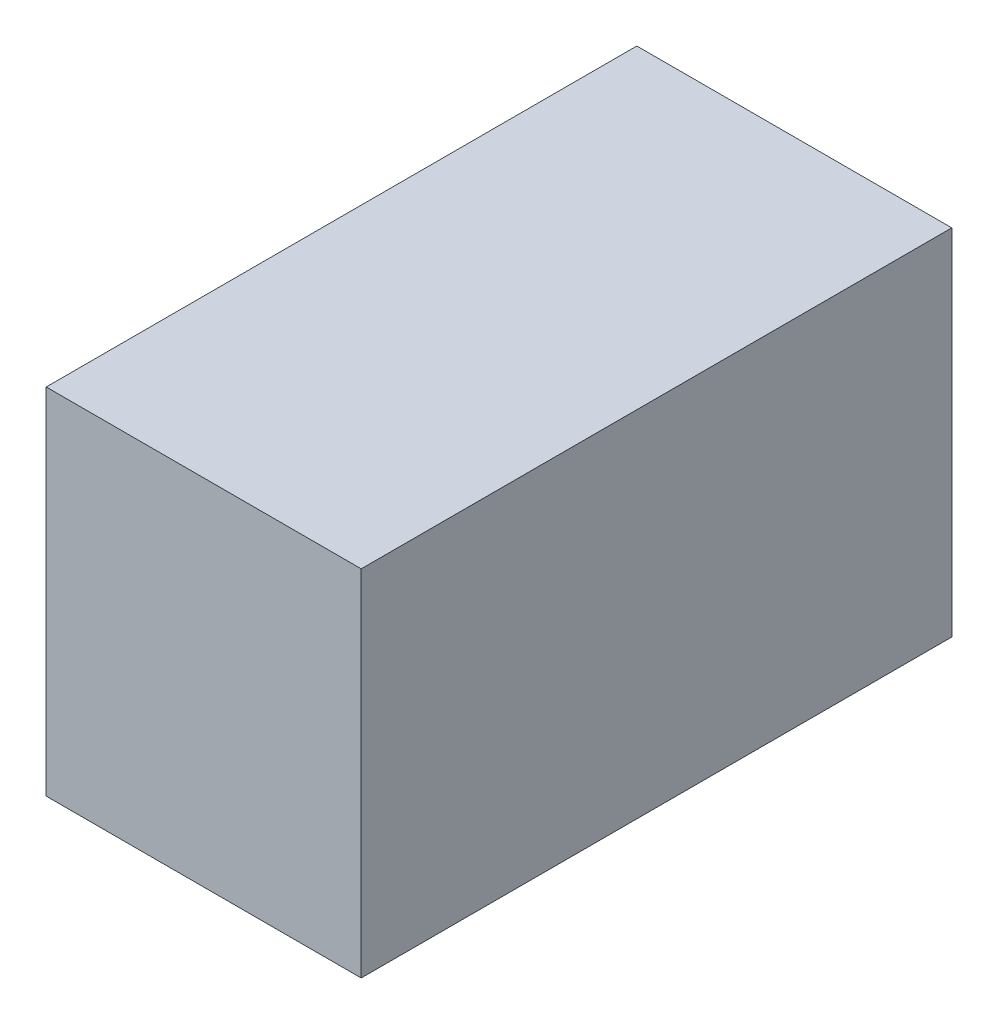
ISO-10303-21;
HEADER;
FILE_DESCRIPTION(('STEP AP214'),'2;1');
FILE_NAME('part.step','',(''),(''),'','','');
FILE_SCHEMA(('AUTOMOTIVE_DESIGN { 1 0 10303 214 1 1 1 1 }'));
ENDSEC;
DATA;
#1=APPLICATION_CONTEXT('core data for automotive mechanical design processes');
#2=APPLICATION_PROTOCOL_DEFINITION('international standard','automotive_design',2000,#1);
#3=PRODUCT_CONTEXT('',#1,'mechanical');
#4=PRODUCT('Part','Part','',(#3));
#5=PRODUCT_RELATED_PRODUCT_CATEGORY('part','',(#4));
#6=PRODUCT_DEFINITION_FORMATION('','',#4);
#7=PRODUCT_DEFINITION_CONTEXT('part definition',#1,'design');
#8=PRODUCT_DEFINITION('design','',#6,#7);
#9=PRODUCT_DEFINITION_SHAPE('','',#8);
#10=(LENGTH_UNIT() NAMED_UNIT(*) SI_UNIT(.MILLI.,.METRE.));
#11=(NAMED_UNIT(*) PLANE_ANGLE_UNIT() SI_UNIT($,.RADIAN.));
#12=(NAMED_UNIT(*) SI_UNIT($,.STERADIAN.) SOLID_ANGLE_UNIT());
#13=UNCERTAINTY_MEASURE_WITH_UNIT(LENGTH_MEASURE(1.E-05),#10,'distance_accuracy_value','');
#14=(GEOMETRIC_REPRESENTATION_CONTEXT(3) GLOBAL_UNCERTAINTY_ASSIGNED_CONTEXT((#13)) GLOBAL_UNIT_ASSIGNED_CONTEXT((#10,
#11,#12)) REPRESENTATION_CONTEXT('',''));
#15=CARTESIAN_POINT('',(0.,0.,0.));
#16=DIRECTION('',(0.,0.,1.));
#17=DIRECTION('',(1.,0.,0.));
#18=AXIS2_PLACEMENT_3D('',#15,#16,#17);
#19=CARTESIAN_POINT('',(0.,0.,190.5));
#20=DIRECTION('',(1.,0.,0.));
#21=DIRECTION('',(0.,0.,-1.));
#22=AXIS2_PLACEMENT_3D('',#19,#20,#21);
#23=PLANE('',#22);
#24=DIRECTION('',(0.,-1.,0.));
#25=VECTOR('',#24,1.);
#26=CARTESIAN_POINT('',(0.,0.,0.));
#27=LINE('',#26,#25);
#28=CARTESIAN_POINT('',(0.,114.3,0.));
#29=VERTEX_POINT('',#28);
#30=CARTESIAN_POINT('',(0.,0.,0.));
#31=VERTEX_POINT('',#30);
#32=EDGE_CURVE('E98',#29,#31,#27,.T.);
#33=ORIENTED_EDGE('',*,*,#32,.T.);
#34=DIRECTION('',(0.,0.,-1.));
#35=VECTOR('',#34,1.);
#36=CARTESIAN_POINT('',(0.,0.,190.5));
#37=LINE('',#36,#35);
#38=CARTESIAN_POINT('',(0.,0.,190.5));
#39=VERTEX_POINT('',#38);
#40=EDGE_CURVE('E11',#39,#31,#37,.T.);
#41=ORIENTED_EDGE('',*,*,#40,.F.);
#42=DIRECTION('',(0.,-1.,0.));
#43=VECTOR('',#42,1.);
#44=CARTESIAN_POINT('',(0.,0.,190.5));
#45=LINE('',#44,#43);
#46=CARTESIAN_POINT('',(0.,114.3,190.5));
#47=VERTEX_POINT('',#46);
#48=EDGE_CURVE('E86',#47,#39,#45,.T.);
#49=ORIENTED_EDGE('',*,*,#48,.F.);
#50=DIRECTION('',(0.,0.,-1.));
#51=VECTOR('',#50,1.);
#52=CARTESIAN_POINT('',(0.,114.3,190.5));
#53=LINE('',#52,#51);
#54=EDGE_CURVE('E94',#47,#29,#53,.T.);
#55=ORIENTED_EDGE('',*,*,#54,.T.);
#56=EDGE_LOOP('',(#33,#41,#49,#55));
#57=FACE_BOUND('',#56,.T.);
#58=ADVANCED_FACE('F35',(#57),#23,.F.);
#59=CARTESIAN_POINT('',(0.,0.,190.5));
#60=DIRECTION('',(0.,1.,0.));
#61=DIRECTION('',(0.,0.,1.));
#62=AXIS2_PLACEMENT_3D('',#59,#60,#61);
#63=PLANE('',#62);
#64=DIRECTION('',(1.,0.,0.));
#65=VECTOR('',#64,1.);
#66=CARTESIAN_POINT('',(0.,0.,0.));
#67=LINE('',#66,#65);
#68=CARTESIAN_POINT('',(101.6,0.,0.));
#69=VERTEX_POINT('',#68);
#70=EDGE_CURVE('E90',#31,#69,#67,.T.);
#71=ORIENTED_EDGE('',*,*,#70,.T.);
#72=DIRECTION('',(0.,0.,-1.));
#73=VECTOR('',#72,1.);
#74=CARTESIAN_POINT('',(101.6,0.,190.5));
#75=LINE('',#74,#73);
#76=CARTESIAN_POINT('',(101.6,0.,190.5));
#77=VERTEX_POINT('',#76);
#78=EDGE_CURVE('E43',#77,#69,#75,.T.);
#79=ORIENTED_EDGE('',*,*,#78,.F.);
#80=DIRECTION('',(1.,0.,0.));
#81=VECTOR('',#80,1.);
#82=CARTESIAN_POINT('',(0.,0.,190.5));
#83=LINE('',#82,#81);
#84=EDGE_CURVE('E81',#39,#77,#83,.T.);
#85=ORIENTED_EDGE('',*,*,#84,.F.);
#86=ORIENTED_EDGE('',*,*,#40,.T.);
#87=EDGE_LOOP('',(#71,#79,#85,#86));
#88=FACE_BOUND('',#87,.T.);
#89=ADVANCED_FACE('F89',(#88),#63,.F.);
#90=CARTESIAN_POINT('',(101.6,0.,190.5));
#91=DIRECTION('',(-1.,0.,0.));
#92=DIRECTION('',(0.,0.,1.));
#93=AXIS2_PLACEMENT_3D('',#90,#91,#92);
#94=PLANE('',#93);
#95=DIRECTION('',(0.,1.,0.));
#96=VECTOR('',#95,1.);
#97=CARTESIAN_POINT('',(101.6,0.,0.));
#98=LINE('',#97,#96);
#99=CARTESIAN_POINT('',(101.6,114.3,0.));
#100=VERTEX_POINT('',#99);
#101=EDGE_CURVE('E68',#69,#100,#98,.T.);
#102=ORIENTED_EDGE('',*,*,#101,.T.);
#103=DIRECTION('',(0.,0.,-1.));
#104=VECTOR('',#103,1.);
#105=CARTESIAN_POINT('',(101.6,114.3,190.5));
#106=LINE('',#105,#104);
#107=CARTESIAN_POINT('',(101.6,114.3,190.5));
#108=VERTEX_POINT('',#107);
#109=EDGE_CURVE('E91',#108,#100,#106,.T.);
#110=ORIENTED_EDGE('',*,*,#109,.F.);
#111=DIRECTION('',(0.,1.,0.));
#112=VECTOR('',#111,1.);
#113=CARTESIAN_POINT('',(101.6,0.,190.5));
#114=LINE('',#113,#112);
#115=EDGE_CURVE('E84',#77,#108,#114,.T.);
#116=ORIENTED_EDGE('',*,*,#115,.F.);
#117=ORIENTED_EDGE('',*,*,#78,.T.);
#118=EDGE_LOOP('',(#102,#110,#116,#117));
#119=FACE_BOUND('',#118,.T.);
#120=ADVANCED_FACE('F92',(#119),#94,.F.);
#121=CARTESIAN_POINT('',(0.,114.3,190.5));
#122=DIRECTION('',(0.,-1.,0.));
#123=DIRECTION('',(0.,0.,-1.));
#124=AXIS2_PLACEMENT_3D('',#121,#122,#123);
#125=PLANE('',#124);
#126=DIRECTION('',(-1.,0.,0.));
#127=VECTOR('',#126,1.);
#128=CARTESIAN_POINT('',(0.,114.3,0.));
#129=LINE('',#128,#127);
#130=EDGE_CURVE('E74',#100,#29,#129,.T.);
#131=ORIENTED_EDGE('',*,*,#130,.T.);
#132=ORIENTED_EDGE('',*,*,#54,.F.);
#133=DIRECTION('',(-1.,0.,0.));
#134=VECTOR('',#133,1.);
#135=CARTESIAN_POINT('',(0.,114.3,190.5));
#136=LINE('',#135,#134);
#137=EDGE_CURVE('E51',#108,#47,#136,.T.);
#138=ORIENTED_EDGE('',*,*,#137,.F.);
#139=ORIENTED_EDGE('',*,*,#109,.T.);
#140=EDGE_LOOP('',(#131,#132,#138,#139));
#141=FACE_BOUND('',#140,.T.);
#142=ADVANCED_FACE('F105',(#141),#125,.F.);
#143=CARTESIAN_POINT('',(0.,0.,190.5));
#144=DIRECTION('',(0.,0.,-1.));
#145=DIRECTION('',(-1.,0.,0.));
#146=AXIS2_PLACEMENT_3D('',#143,#144,#145);
#147=PLANE('',#146);
#148=ORIENTED_EDGE('',*,*,#48,.T.);
#149=ORIENTED_EDGE('',*,*,#84,.T.);
#150=ORIENTED_EDGE('',*,*,#115,.T.);
#151=ORIENTED_EDGE('',*,*,#137,.T.);
#152=EDGE_LOOP('',(#148,#149,#150,#151));
#153=FACE_BOUND('',#152,.T.);
#154=ADVANCED_FACE('F82',(#153),#147,.F.);
#155=CARTESIAN_POINT('',(0.,0.,0.));
#156=DIRECTION('',(0.,0.,-1.));
#157=DIRECTION('',(-1.,0.,0.));
#158=AXIS2_PLACEMENT_3D('',#155,#156,#157);
#159=PLANE('',#158);
#160=ORIENTED_EDGE('',*,*,#32,.F.);
#161=ORIENTED_EDGE('',*,*,#130,.F.);
#162=ORIENTED_EDGE('',*,*,#101,.F.);
#163=ORIENTED_EDGE('',*,*,#70,.F.);
#164=EDGE_LOOP('',(#160,#161,#162,#163));
#165=FACE_BOUND('',#164,.T.);
#166=ADVANCED_FACE('F108',(#165),#159,.T.);
#167=CLOSED_SHELL('',(#58,#89,#120,#142,#154,#166));
#168=MANIFOLD_SOLID_BREP('B2',#167);
#169=ADVANCED_BREP_SHAPE_REPRESENTATION('',(#18,#168),#14);
#170=SHAPE_DEFINITION_REPRESENTATION(#9,#169);
ENDSEC;
END-ISO-10303-21;
